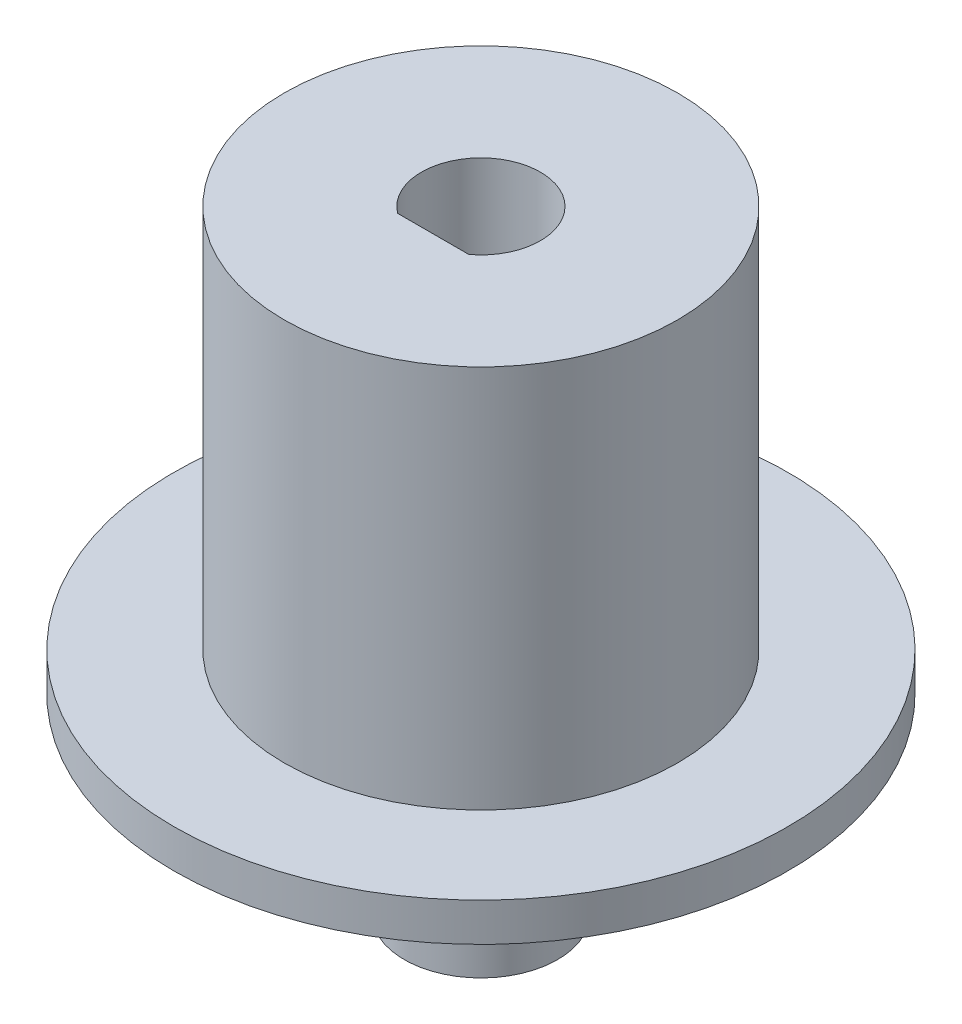
ISO-10303-21;
HEADER;
FILE_DESCRIPTION(('STEP AP214'),'2;1');
FILE_NAME('part.step','',(''),(''),'','','');
FILE_SCHEMA(('AUTOMOTIVE_DESIGN { 1 0 10303 214 1 1 1 1 }'));
ENDSEC;
DATA;
#1=APPLICATION_CONTEXT('core data for automotive mechanical design processes');
#2=APPLICATION_PROTOCOL_DEFINITION('international standard','automotive_design',2000,#1);
#3=PRODUCT_CONTEXT('',#1,'mechanical');
#4=PRODUCT('Part','Part','',(#3));
#5=PRODUCT_RELATED_PRODUCT_CATEGORY('part','',(#4));
#6=PRODUCT_DEFINITION_FORMATION('','',#4);
#7=PRODUCT_DEFINITION_CONTEXT('part definition',#1,'design');
#8=PRODUCT_DEFINITION('design','',#6,#7);
#9=PRODUCT_DEFINITION_SHAPE('','',#8);
#10=(LENGTH_UNIT() NAMED_UNIT(*) SI_UNIT(.MILLI.,.METRE.));
#11=(NAMED_UNIT(*) PLANE_ANGLE_UNIT() SI_UNIT($,.RADIAN.));
#12=(NAMED_UNIT(*) SI_UNIT($,.STERADIAN.) SOLID_ANGLE_UNIT());
#13=UNCERTAINTY_MEASURE_WITH_UNIT(LENGTH_MEASURE(1.E-05),#10,'distance_accuracy_value','');
#14=(GEOMETRIC_REPRESENTATION_CONTEXT(3) GLOBAL_UNCERTAINTY_ASSIGNED_CONTEXT((#13)) GLOBAL_UNIT_ASSIGNED_CONTEXT((#10,
#11,#12)) REPRESENTATION_CONTEXT('',''));
#15=CARTESIAN_POINT('',(0.,0.,0.));
#16=DIRECTION('',(0.,0.,1.));
#17=DIRECTION('',(1.,0.,0.));
#18=AXIS2_PLACEMENT_3D('',#15,#16,#17);
#19=CARTESIAN_POINT('',(0.,22.,0.));
#20=DIRECTION('',(0.,1.,0.));
#21=DIRECTION('',(0.,0.,1.));
#22=AXIS2_PLACEMENT_3D('',#19,#20,#21);
#23=PLANE('',#22);
#24=CARTESIAN_POINT('',(0.,22.,0.));
#25=DIRECTION('',(0.,1.,0.));
#26=DIRECTION('',(0.,0.,1.));
#27=AXIS2_PLACEMENT_3D('',#24,#25,#26);
#28=CIRCLE('',#27,10.25);
#29=CARTESIAN_POINT('',(0.,22.,10.25));
#30=VERTEX_POINT('',#29);
#31=EDGE_CURVE('E88',#30,#30,#28,.T.);
#32=ORIENTED_EDGE('',*,*,#31,.T.);
#33=EDGE_LOOP('',(#32));
#34=FACE_BOUND('',#33,.T.);
#35=CARTESIAN_POINT('',(0.,22.,0.));
#36=DIRECTION('',(0.,-1.,0.));
#37=DIRECTION('',(0.,0.,-1.));
#38=AXIS2_PLACEMENT_3D('',#35,#36,#37);
#39=CIRCLE('',#38,3.1);
#40=CARTESIAN_POINT('',(-1.85377221528594,22.,2.48465864332182));
#41=VERTEX_POINT('',#40);
#42=CARTESIAN_POINT('',(1.85377221528594,22.,2.48465864332182));
#43=VERTEX_POINT('',#42);
#44=EDGE_CURVE('E84',#41,#43,#39,.T.);
#45=ORIENTED_EDGE('',*,*,#44,.T.);
#46=DIRECTION('',(1.,0.,0.));
#47=VECTOR('',#46,1.);
#48=CARTESIAN_POINT('',(0.,22.,2.48465864332182));
#49=LINE('',#48,#47);
#50=EDGE_CURVE('E70',#41,#43,#49,.T.);
#51=ORIENTED_EDGE('',*,*,#50,.F.);
#52=EDGE_LOOP('',(#45,#51));
#53=FACE_BOUND('',#52,.T.);
#54=ADVANCED_FACE('F39',(#34,#53),#23,.T.);
#55=CARTESIAN_POINT('',(0.,-10.,0.));
#56=DIRECTION('',(0.,-1.,0.));
#57=DIRECTION('',(0.,0.,-1.));
#58=AXIS2_PLACEMENT_3D('',#55,#56,#57);
#59=PLANE('',#58);
#60=CARTESIAN_POINT('',(0.,-10.,0.));
#61=DIRECTION('',(0.,-1.,0.));
#62=DIRECTION('',(0.,0.,-1.));
#63=AXIS2_PLACEMENT_3D('',#60,#61,#62);
#64=CIRCLE('',#63,4.);
#65=CARTESIAN_POINT('',(0.,-10.,-4.));
#66=VERTEX_POINT('',#65);
#67=EDGE_CURVE('E72',#66,#66,#64,.T.);
#68=ORIENTED_EDGE('',*,*,#67,.T.);
#69=EDGE_LOOP('',(#68));
#70=FACE_BOUND('',#69,.T.);
#71=CARTESIAN_POINT('',(0.,-10.,0.));
#72=DIRECTION('',(0.,-1.,0.));
#73=DIRECTION('',(0.,0.,-1.));
#74=AXIS2_PLACEMENT_3D('',#71,#72,#73);
#75=CIRCLE('',#74,3.1);
#76=CARTESIAN_POINT('',(-1.85377221528594,-10.,2.48465864332182));
#77=VERTEX_POINT('',#76);
#78=CARTESIAN_POINT('',(1.85377221528594,-10.,2.48465864332182));
#79=VERTEX_POINT('',#78);
#80=EDGE_CURVE('E76',#77,#79,#75,.T.);
#81=ORIENTED_EDGE('',*,*,#80,.F.);
#82=DIRECTION('',(1.,0.,0.));
#83=VECTOR('',#82,1.);
#84=CARTESIAN_POINT('',(0.,-10.,2.48465864332182));
#85=LINE('',#84,#83);
#86=EDGE_CURVE('E63',#77,#79,#85,.T.);
#87=ORIENTED_EDGE('',*,*,#86,.T.);
#88=EDGE_LOOP('',(#81,#87));
#89=FACE_BOUND('',#88,.T.);
#90=ADVANCED_FACE('F80',(#70,#89),#59,.T.);
#91=CARTESIAN_POINT('',(0.,2.,0.));
#92=DIRECTION('',(0.,-1.,0.));
#93=DIRECTION('',(0.,0.,-1.));
#94=AXIS2_PLACEMENT_3D('',#91,#92,#93);
#95=CYLINDRICAL_SURFACE('',#94,16.);
#96=CARTESIAN_POINT('',(0.,2.,0.));
#97=DIRECTION('',(0.,1.,0.));
#98=DIRECTION('',(0.,0.,1.));
#99=AXIS2_PLACEMENT_3D('',#96,#97,#98);
#100=CIRCLE('',#99,16.);
#101=CARTESIAN_POINT('',(0.,2.,16.));
#102=VERTEX_POINT('',#101);
#103=EDGE_CURVE('E93',#102,#102,#100,.T.);
#104=ORIENTED_EDGE('',*,*,#103,.F.);
#105=EDGE_LOOP('',(#104));
#106=FACE_BOUND('',#105,.T.);
#107=CARTESIAN_POINT('',(0.,0.,0.));
#108=DIRECTION('',(0.,1.,0.));
#109=DIRECTION('',(0.,0.,1.));
#110=AXIS2_PLACEMENT_3D('',#107,#108,#109);
#111=CIRCLE('',#110,16.);
#112=CARTESIAN_POINT('',(0.,0.,16.));
#113=VERTEX_POINT('',#112);
#114=EDGE_CURVE('E43',#113,#113,#111,.T.);
#115=ORIENTED_EDGE('',*,*,#114,.T.);
#116=EDGE_LOOP('',(#115));
#117=FACE_BOUND('',#116,.T.);
#118=ADVANCED_FACE('F41',(#106,#117),#95,.T.);
#119=CARTESIAN_POINT('',(0.,2.,0.));
#120=DIRECTION('',(0.,1.,0.));
#121=DIRECTION('',(0.,0.,1.));
#122=AXIS2_PLACEMENT_3D('',#119,#120,#121);
#123=PLANE('',#122);
#124=CARTESIAN_POINT('',(0.,2.,0.));
#125=DIRECTION('',(0.,1.,0.));
#126=DIRECTION('',(0.,0.,1.));
#127=AXIS2_PLACEMENT_3D('',#124,#125,#126);
#128=CIRCLE('',#127,10.25);
#129=CARTESIAN_POINT('',(0.,2.,10.25));
#130=VERTEX_POINT('',#129);
#131=EDGE_CURVE('E48',#130,#130,#128,.T.);
#132=ORIENTED_EDGE('',*,*,#131,.F.);
#133=EDGE_LOOP('',(#132));
#134=FACE_BOUND('',#133,.T.);
#135=ORIENTED_EDGE('',*,*,#103,.T.);
#136=EDGE_LOOP('',(#135));
#137=FACE_BOUND('',#136,.T.);
#138=ADVANCED_FACE('F104',(#134,#137),#123,.T.);
#139=CARTESIAN_POINT('',(0.,0.,0.));
#140=DIRECTION('',(0.,1.,0.));
#141=DIRECTION('',(0.,0.,1.));
#142=AXIS2_PLACEMENT_3D('',#139,#140,#141);
#143=PLANE('',#142);
#144=CARTESIAN_POINT('',(0.,0.,0.));
#145=DIRECTION('',(0.,-1.,0.));
#146=DIRECTION('',(0.,0.,-1.));
#147=AXIS2_PLACEMENT_3D('',#144,#145,#146);
#148=CIRCLE('',#147,4.);
#149=CARTESIAN_POINT('',(0.,0.,-4.));
#150=VERTEX_POINT('',#149);
#151=EDGE_CURVE('E11',#150,#150,#148,.T.);
#152=ORIENTED_EDGE('',*,*,#151,.F.);
#153=EDGE_LOOP('',(#152));
#154=FACE_BOUND('',#153,.T.);
#155=ORIENTED_EDGE('',*,*,#114,.F.);
#156=EDGE_LOOP('',(#155));
#157=FACE_BOUND('',#156,.T.);
#158=ADVANCED_FACE('F101',(#154,#157),#143,.F.);
#159=CARTESIAN_POINT('',(0.,22.,0.));
#160=DIRECTION('',(0.,-1.,0.));
#161=DIRECTION('',(0.,0.,-1.));
#162=AXIS2_PLACEMENT_3D('',#159,#160,#161);
#163=CYLINDRICAL_SURFACE('',#162,10.25);
#164=ORIENTED_EDGE('',*,*,#31,.F.);
#165=EDGE_LOOP('',(#164));
#166=FACE_BOUND('',#165,.T.);
#167=ORIENTED_EDGE('',*,*,#131,.T.);
#168=EDGE_LOOP('',(#167));
#169=FACE_BOUND('',#168,.T.);
#170=ADVANCED_FACE('F103',(#166,#169),#163,.T.);
#171=CARTESIAN_POINT('',(0.,-10.,0.));
#172=DIRECTION('',(0.,1.,0.));
#173=DIRECTION('',(0.,0.,1.));
#174=AXIS2_PLACEMENT_3D('',#171,#172,#173);
#175=CYLINDRICAL_SURFACE('',#174,4.);
#176=ORIENTED_EDGE('',*,*,#67,.F.);
#177=EDGE_LOOP('',(#176));
#178=FACE_BOUND('',#177,.T.);
#179=ORIENTED_EDGE('',*,*,#151,.T.);
#180=EDGE_LOOP('',(#179));
#181=FACE_BOUND('',#180,.T.);
#182=ADVANCED_FACE('F110',(#178,#181),#175,.T.);
#183=CARTESIAN_POINT('',(0.,22.,2.48465864332182));
#184=DIRECTION('',(0.,0.,-1.));
#185=DIRECTION('',(-1.,0.,0.));
#186=AXIS2_PLACEMENT_3D('',#183,#184,#185);
#187=PLANE('',#186);
#188=DIRECTION('',(0.,-1.,0.));
#189=VECTOR('',#188,1.);
#190=CARTESIAN_POINT('',(-1.85377221528594,22.,2.48465864332182));
#191=LINE('',#190,#189);
#192=EDGE_CURVE('E73',#41,#77,#191,.T.);
#193=ORIENTED_EDGE('',*,*,#192,.F.);
#194=ORIENTED_EDGE('',*,*,#50,.T.);
#195=DIRECTION('',(0.,-1.,0.));
#196=VECTOR('',#195,1.);
#197=CARTESIAN_POINT('',(1.85377221528594,22.,2.48465864332182));
#198=LINE('',#197,#196);
#199=EDGE_CURVE('E56',#43,#79,#198,.T.);
#200=ORIENTED_EDGE('',*,*,#199,.T.);
#201=ORIENTED_EDGE('',*,*,#86,.F.);
#202=EDGE_LOOP('',(#193,#194,#200,#201));
#203=FACE_BOUND('',#202,.T.);
#204=ADVANCED_FACE('F68',(#203),#187,.T.);
#205=CARTESIAN_POINT('',(0.,22.,0.));
#206=DIRECTION('',(0.,-1.,0.));
#207=DIRECTION('',(0.,0.,-1.));
#208=AXIS2_PLACEMENT_3D('',#205,#206,#207);
#209=CYLINDRICAL_SURFACE('',#208,3.1);
#210=ORIENTED_EDGE('',*,*,#199,.F.);
#211=ORIENTED_EDGE('',*,*,#44,.F.);
#212=ORIENTED_EDGE('',*,*,#192,.T.);
#213=ORIENTED_EDGE('',*,*,#80,.T.);
#214=EDGE_LOOP('',(#210,#211,#212,#213));
#215=FACE_BOUND('',#214,.T.);
#216=ADVANCED_FACE('F77',(#215),#209,.F.);
#217=CLOSED_SHELL('',(#54,#90,#118,#138,#158,#170,#182,#204,#216));
#218=MANIFOLD_SOLID_BREP('B2',#217);
#219=ADVANCED_BREP_SHAPE_REPRESENTATION('',(#18,#218),#14);
#220=SHAPE_DEFINITION_REPRESENTATION(#9,#219);
ENDSEC;
END-ISO-10303-21;
